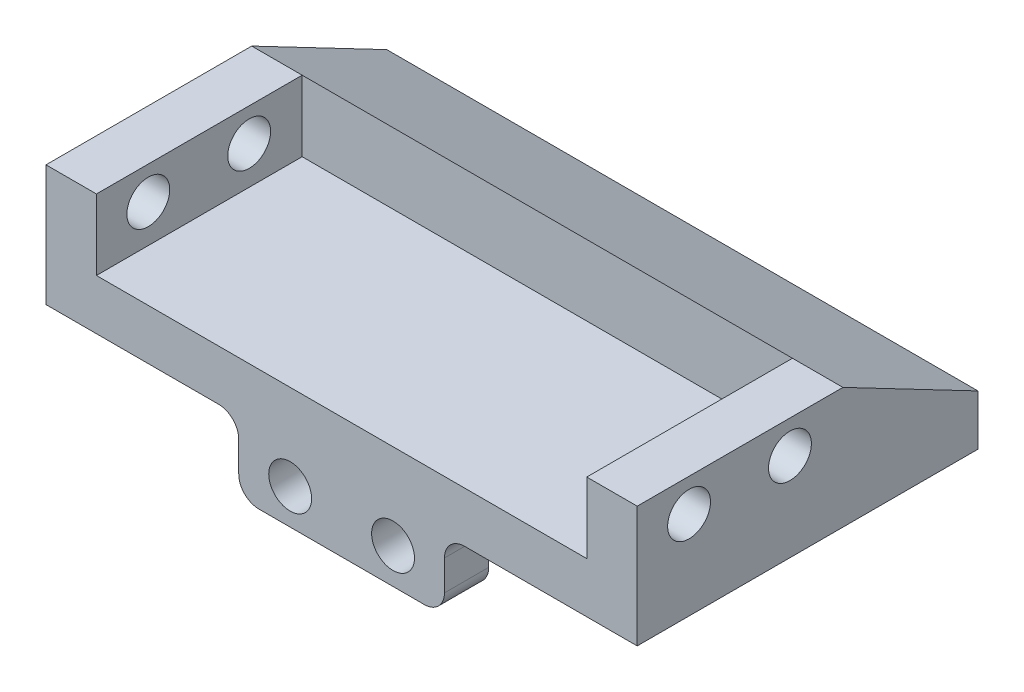
ISO-10303-21;
HEADER;
FILE_DESCRIPTION(('STEP AP214'),'2;1');
FILE_NAME('part.step','',(''),(''),'','','');
FILE_SCHEMA(('AUTOMOTIVE_DESIGN { 1 0 10303 214 1 1 1 1 }'));
ENDSEC;
DATA;
#1=APPLICATION_CONTEXT('core data for automotive mechanical design processes');
#2=APPLICATION_PROTOCOL_DEFINITION('international standard','automotive_design',2000,#1);
#3=PRODUCT_CONTEXT('',#1,'mechanical');
#4=PRODUCT('Part','Part','',(#3));
#5=PRODUCT_RELATED_PRODUCT_CATEGORY('part','',(#4));
#6=PRODUCT_DEFINITION_FORMATION('','',#4);
#7=PRODUCT_DEFINITION_CONTEXT('part definition',#1,'design');
#8=PRODUCT_DEFINITION('design','',#6,#7);
#9=PRODUCT_DEFINITION_SHAPE('','',#8);
#10=(LENGTH_UNIT() NAMED_UNIT(*) SI_UNIT(.MILLI.,.METRE.));
#11=(NAMED_UNIT(*) PLANE_ANGLE_UNIT() SI_UNIT($,.RADIAN.));
#12=(NAMED_UNIT(*) SI_UNIT($,.STERADIAN.) SOLID_ANGLE_UNIT());
#13=UNCERTAINTY_MEASURE_WITH_UNIT(LENGTH_MEASURE(1.E-05),#10,'distance_accuracy_value','');
#14=(GEOMETRIC_REPRESENTATION_CONTEXT(3) GLOBAL_UNCERTAINTY_ASSIGNED_CONTEXT((#13)) GLOBAL_UNIT_ASSIGNED_CONTEXT((#10,
#11,#12)) REPRESENTATION_CONTEXT('',''));
#15=CARTESIAN_POINT('',(0.,0.,0.));
#16=DIRECTION('',(0.,0.,1.));
#17=DIRECTION('',(1.,0.,0.));
#18=AXIS2_PLACEMENT_3D('',#15,#16,#17);
#19=CARTESIAN_POINT('',(0.,5.,0.));
#20=DIRECTION('',(1.,0.,0.));
#21=DIRECTION('',(0.,0.,-1.));
#22=AXIS2_PLACEMENT_3D('',#19,#20,#21);
#23=PLANE('',#22);
#24=CARTESIAN_POINT('',(0.,8.75,-15.13979341));
#25=DIRECTION('',(1.,0.,0.));
#26=DIRECTION('',(0.,0.,-1.));
#27=AXIS2_PLACEMENT_3D('',#24,#25,#26);
#28=CIRCLE('',#27,2.125);
#29=CARTESIAN_POINT('',(0.,8.75,-17.26479341));
#30=VERTEX_POINT('',#29);
#31=EDGE_CURVE('E240',#30,#30,#28,.T.);
#32=ORIENTED_EDGE('',*,*,#31,.T.);
#33=EDGE_LOOP('',(#32));
#34=FACE_BOUND('',#33,.T.);
#35=CARTESIAN_POINT('',(0.,8.75,-5.13979341));
#36=DIRECTION('',(1.,0.,0.));
#37=DIRECTION('',(0.,0.,-1.));
#38=AXIS2_PLACEMENT_3D('',#35,#36,#37);
#39=CIRCLE('',#38,2.125);
#40=CARTESIAN_POINT('',(0.,8.75,-7.26479341));
#41=VERTEX_POINT('',#40);
#42=EDGE_CURVE('E233',#41,#41,#39,.T.);
#43=ORIENTED_EDGE('',*,*,#42,.T.);
#44=EDGE_LOOP('',(#43));
#45=FACE_BOUND('',#44,.T.);
#46=DIRECTION('',(0.,0.,-1.));
#47=VECTOR('',#46,1.);
#48=CARTESIAN_POINT('',(0.,12.,-20.38979341));
#49=LINE('',#48,#47);
#50=CARTESIAN_POINT('',(0.,12.,0.));
#51=VERTEX_POINT('',#50);
#52=CARTESIAN_POINT('',(0.,12.,-20.38979341));
#53=VERTEX_POINT('',#52);
#54=EDGE_CURVE('E243',#51,#53,#49,.T.);
#55=ORIENTED_EDGE('',*,*,#54,.T.);
#56=DIRECTION('',(0.,-0.463295264219725,-0.88620398224764));
#57=VECTOR('',#56,1.);
#58=CARTESIAN_POINT('',(0.,12.,-20.38979341));
#59=LINE('',#58,#57);
#60=CARTESIAN_POINT('',(0.,5.,-33.77958682));
#61=VERTEX_POINT('',#60);
#62=EDGE_CURVE('E519',#53,#61,#59,.T.);
#63=ORIENTED_EDGE('',*,*,#62,.T.);
#64=DIRECTION('',(0.,1.,0.));
#65=VECTOR('',#64,1.);
#66=CARTESIAN_POINT('',(0.,0.,-33.77958682));
#67=LINE('',#66,#65);
#68=CARTESIAN_POINT('',(0.,0.,-33.77958682));
#69=VERTEX_POINT('',#68);
#70=EDGE_CURVE('E465',#69,#61,#67,.T.);
#71=ORIENTED_EDGE('',*,*,#70,.F.);
#72=DIRECTION('',(0.,0.,1.));
#73=VECTOR('',#72,1.);
#74=CARTESIAN_POINT('',(0.,0.,0.));
#75=LINE('',#74,#73);
#76=CARTESIAN_POINT('',(0.,0.,0.));
#77=VERTEX_POINT('',#76);
#78=EDGE_CURVE('E261',#69,#77,#75,.T.);
#79=ORIENTED_EDGE('',*,*,#78,.T.);
#80=DIRECTION('',(0.,-1.,0.));
#81=VECTOR('',#80,1.);
#82=CARTESIAN_POINT('',(0.,5.,0.));
#83=LINE('',#82,#81);
#84=EDGE_CURVE('E275',#51,#77,#83,.T.);
#85=ORIENTED_EDGE('',*,*,#84,.F.);
#86=EDGE_LOOP('',(#55,#63,#71,#79,#85));
#87=FACE_BOUND('',#86,.T.);
#88=ADVANCED_FACE('F38',(#34,#45,#87),#23,.F.);
#89=CARTESIAN_POINT('',(0.,5.,0.));
#90=DIRECTION('',(0.,0.,-1.));
#91=DIRECTION('',(-1.,0.,0.));
#92=AXIS2_PLACEMENT_3D('',#89,#90,#91);
#93=PLANE('',#92);
#94=CARTESIAN_POINT('',(34.3974483525,-3.49999999999999,0.));
#95=DIRECTION('',(0.,0.,1.));
#96=DIRECTION('',(1.,0.,0.));
#97=AXIS2_PLACEMENT_3D('',#94,#95,#96);
#98=CIRCLE('',#97,2.125);
#99=CARTESIAN_POINT('',(36.5224483525,-3.49999999999999,0.));
#100=VERTEX_POINT('',#99);
#101=EDGE_CURVE('E283',#100,#100,#98,.T.);
#102=ORIENTED_EDGE('',*,*,#101,.F.);
#103=EDGE_LOOP('',(#102));
#104=FACE_BOUND('',#103,.T.);
#105=CARTESIAN_POINT('',(24.2025516475,-3.49999999999999,0.));
#106=DIRECTION('',(0.,0.,1.));
#107=DIRECTION('',(-1.,0.,0.));
#108=AXIS2_PLACEMENT_3D('',#105,#106,#107);
#109=CIRCLE('',#108,2.125);
#110=CARTESIAN_POINT('',(22.0775516475,-3.49999999999999,0.));
#111=VERTEX_POINT('',#110);
#112=EDGE_CURVE('E467',#111,#111,#109,.T.);
#113=ORIENTED_EDGE('',*,*,#112,.F.);
#114=EDGE_LOOP('',(#113));
#115=FACE_BOUND('',#114,.T.);
#116=DIRECTION('',(0.,-1.,0.));
#117=VECTOR('',#116,1.);
#118=CARTESIAN_POINT('',(19.105103295,0.,0.));
#119=LINE('',#118,#117);
#120=CARTESIAN_POINT('',(19.105103295,-2.,0.));
#121=VERTEX_POINT('',#120);
#122=CARTESIAN_POINT('',(19.105103295,-5.,0.));
#123=VERTEX_POINT('',#122);
#124=EDGE_CURVE('E322',#121,#123,#119,.T.);
#125=ORIENTED_EDGE('',*,*,#124,.T.);
#126=CARTESIAN_POINT('',(21.105103295,-5.,0.));
#127=DIRECTION('',(0.,0.,-1.));
#128=DIRECTION('',(-1.,0.,0.));
#129=AXIS2_PLACEMENT_3D('',#126,#127,#128);
#130=CIRCLE('',#129,2.);
#131=CARTESIAN_POINT('',(21.105103295,-7.,0.));
#132=VERTEX_POINT('',#131);
#133=EDGE_CURVE('E293',#123,#132,#130,.F.);
#134=ORIENTED_EDGE('',*,*,#133,.T.);
#135=DIRECTION('',(1.,0.,0.));
#136=VECTOR('',#135,1.);
#137=CARTESIAN_POINT('',(39.494896705,-6.99999999999999,0.));
#138=LINE('',#137,#136);
#139=CARTESIAN_POINT('',(37.494896705,-6.99999999999999,0.));
#140=VERTEX_POINT('',#139);
#141=EDGE_CURVE('E331',#132,#140,#138,.T.);
#142=ORIENTED_EDGE('',*,*,#141,.T.);
#143=CARTESIAN_POINT('',(37.494896705,-4.99999999999999,0.));
#144=DIRECTION('',(0.,0.,-1.));
#145=DIRECTION('',(-1.,0.,0.));
#146=AXIS2_PLACEMENT_3D('',#143,#144,#145);
#147=CIRCLE('',#146,2.);
#148=CARTESIAN_POINT('',(39.494896705,-4.99999999999999,0.));
#149=VERTEX_POINT('',#148);
#150=EDGE_CURVE('E291',#140,#149,#147,.F.);
#151=ORIENTED_EDGE('',*,*,#150,.T.);
#152=DIRECTION('',(0.,1.,0.));
#153=VECTOR('',#152,1.);
#154=CARTESIAN_POINT('',(39.494896705,0.,0.));
#155=LINE('',#154,#153);
#156=CARTESIAN_POINT('',(39.494896705,-2.,0.));
#157=VERTEX_POINT('',#156);
#158=EDGE_CURVE('E286',#149,#157,#155,.T.);
#159=ORIENTED_EDGE('',*,*,#158,.T.);
#160=CARTESIAN_POINT('',(41.494896705,-2.,0.));
#161=DIRECTION('',(0.,0.,-1.));
#162=DIRECTION('',(-1.,0.,0.));
#163=AXIS2_PLACEMENT_3D('',#160,#161,#162);
#164=CIRCLE('',#163,2.);
#165=CARTESIAN_POINT('',(41.494896705,0.,0.));
#166=VERTEX_POINT('',#165);
#167=EDGE_CURVE('E315',#157,#166,#164,.T.);
#168=ORIENTED_EDGE('',*,*,#167,.T.);
#169=DIRECTION('',(1.,0.,0.));
#170=VECTOR('',#169,1.);
#171=CARTESIAN_POINT('',(0.,0.,0.));
#172=LINE('',#171,#170);
#173=CARTESIAN_POINT('',(58.6,0.,0.));
#174=VERTEX_POINT('',#173);
#175=EDGE_CURVE('E267',#166,#174,#172,.T.);
#176=ORIENTED_EDGE('',*,*,#175,.T.);
#177=DIRECTION('',(0.,-1.,0.));
#178=VECTOR('',#177,1.);
#179=CARTESIAN_POINT('',(58.6,5.,0.));
#180=LINE('',#179,#178);
#181=CARTESIAN_POINT('',(58.6,12.,0.));
#182=VERTEX_POINT('',#181);
#183=EDGE_CURVE('E263',#182,#174,#180,.T.);
#184=ORIENTED_EDGE('',*,*,#183,.F.);
#185=DIRECTION('',(1.,0.,0.));
#186=VECTOR('',#185,1.);
#187=CARTESIAN_POINT('',(53.6,12.,0.));
#188=LINE('',#187,#186);
#189=CARTESIAN_POINT('',(53.6,12.,0.));
#190=VERTEX_POINT('',#189);
#191=EDGE_CURVE('E230',#190,#182,#188,.T.);
#192=ORIENTED_EDGE('',*,*,#191,.F.);
#193=DIRECTION('',(0.,1.,0.));
#194=VECTOR('',#193,1.);
#195=CARTESIAN_POINT('',(53.6,0.,0.));
#196=LINE('',#195,#194);
#197=CARTESIAN_POINT('',(53.6,5.,0.));
#198=VERTEX_POINT('',#197);
#199=EDGE_CURVE('E236',#198,#190,#196,.T.);
#200=ORIENTED_EDGE('',*,*,#199,.F.);
#201=DIRECTION('',(1.,0.,0.));
#202=VECTOR('',#201,1.);
#203=CARTESIAN_POINT('',(0.,5.,0.));
#204=LINE('',#203,#202);
#205=CARTESIAN_POINT('',(5.,5.,0.));
#206=VERTEX_POINT('',#205);
#207=EDGE_CURVE('E228',#206,#198,#204,.T.);
#208=ORIENTED_EDGE('',*,*,#207,.F.);
#209=DIRECTION('',(0.,1.,0.));
#210=VECTOR('',#209,1.);
#211=CARTESIAN_POINT('',(5.,0.,0.));
#212=LINE('',#211,#210);
#213=CARTESIAN_POINT('',(5.,12.,0.));
#214=VERTEX_POINT('',#213);
#215=EDGE_CURVE('E249',#206,#214,#212,.T.);
#216=ORIENTED_EDGE('',*,*,#215,.T.);
#217=DIRECTION('',(-1.,0.,0.));
#218=VECTOR('',#217,1.);
#219=CARTESIAN_POINT('',(5.,12.,0.));
#220=LINE('',#219,#218);
#221=EDGE_CURVE('E254',#214,#51,#220,.T.);
#222=ORIENTED_EDGE('',*,*,#221,.T.);
#223=ORIENTED_EDGE('',*,*,#84,.T.);
#224=CARTESIAN_POINT('',(17.105103295,0.,0.));
#225=VERTEX_POINT('',#224);
#226=EDGE_CURVE('E268',#77,#225,#172,.T.);
#227=ORIENTED_EDGE('',*,*,#226,.T.);
#228=CARTESIAN_POINT('',(17.105103295,-2.,0.));
#229=DIRECTION('',(0.,0.,-1.));
#230=DIRECTION('',(-1.,0.,0.));
#231=AXIS2_PLACEMENT_3D('',#228,#229,#230);
#232=CIRCLE('',#231,2.);
#233=EDGE_CURVE('E46',#225,#121,#232,.T.);
#234=ORIENTED_EDGE('',*,*,#233,.T.);
#235=EDGE_LOOP('',(#125,#134,#142,#151,#159,#168,#176,#184,#192,#200,#208,#216,#222,#223,#227,#234));
#236=FACE_BOUND('',#235,.T.);
#237=ADVANCED_FACE('F321',(#104,#115,#236),#93,.F.);
#238=CARTESIAN_POINT('',(58.6,5.,0.));
#239=DIRECTION('',(-1.,0.,0.));
#240=DIRECTION('',(0.,0.,1.));
#241=AXIS2_PLACEMENT_3D('',#238,#239,#240);
#242=PLANE('',#241);
#243=DIRECTION('',(0.,0.463295264219725,0.88620398224764));
#244=VECTOR('',#243,1.);
#245=CARTESIAN_POINT('',(58.6,18.869023730878,-7.25053502645087));
#246=LINE('',#245,#244);
#247=CARTESIAN_POINT('',(58.6,5.,-33.77958682));
#248=VERTEX_POINT('',#247);
#249=CARTESIAN_POINT('',(58.6,12.,-20.38979341));
#250=VERTEX_POINT('',#249);
#251=EDGE_CURVE('E379',#248,#250,#246,.T.);
#252=ORIENTED_EDGE('',*,*,#251,.T.);
#253=DIRECTION('',(0.,0.,-1.));
#254=VECTOR('',#253,1.);
#255=CARTESIAN_POINT('',(58.6,12.,-20.38979341));
#256=LINE('',#255,#254);
#257=EDGE_CURVE('E356',#182,#250,#256,.T.);
#258=ORIENTED_EDGE('',*,*,#257,.F.);
#259=ORIENTED_EDGE('',*,*,#183,.T.);
#260=DIRECTION('',(0.,0.,-1.));
#261=VECTOR('',#260,1.);
#262=CARTESIAN_POINT('',(58.6,0.,0.));
#263=LINE('',#262,#261);
#264=CARTESIAN_POINT('',(58.6,0.,-33.77958682));
#265=VERTEX_POINT('',#264);
#266=EDGE_CURVE('E264',#174,#265,#263,.T.);
#267=ORIENTED_EDGE('',*,*,#266,.T.);
#268=DIRECTION('',(0.,-1.,0.));
#269=VECTOR('',#268,1.);
#270=CARTESIAN_POINT('',(58.6,12.,-33.77958682));
#271=LINE('',#270,#269);
#272=EDGE_CURVE('E380',#248,#265,#271,.T.);
#273=ORIENTED_EDGE('',*,*,#272,.F.);
#274=EDGE_LOOP('',(#252,#258,#259,#267,#273));
#275=FACE_BOUND('',#274,.T.);
#276=CARTESIAN_POINT('',(58.6,8.75,-15.13979341));
#277=DIRECTION('',(1.,0.,0.));
#278=DIRECTION('',(0.,0.,-1.));
#279=AXIS2_PLACEMENT_3D('',#276,#277,#278);
#280=CIRCLE('',#279,2.125);
#281=CARTESIAN_POINT('',(58.6,8.75,-17.26479341));
#282=VERTEX_POINT('',#281);
#283=EDGE_CURVE('E353',#282,#282,#280,.T.);
#284=ORIENTED_EDGE('',*,*,#283,.F.);
#285=EDGE_LOOP('',(#284));
#286=FACE_BOUND('',#285,.T.);
#287=CARTESIAN_POINT('',(58.6,8.75,-5.13979341));
#288=DIRECTION('',(1.,0.,0.));
#289=DIRECTION('',(0.,0.,-1.));
#290=AXIS2_PLACEMENT_3D('',#287,#288,#289);
#291=CIRCLE('',#290,2.125);
#292=CARTESIAN_POINT('',(58.6,8.75,-7.26479341));
#293=VERTEX_POINT('',#292);
#294=EDGE_CURVE('E360',#293,#293,#291,.T.);
#295=ORIENTED_EDGE('',*,*,#294,.F.);
#296=EDGE_LOOP('',(#295));
#297=FACE_BOUND('',#296,.T.);
#298=ADVANCED_FACE('F375',(#275,#286,#297),#242,.F.);
#299=CARTESIAN_POINT('',(0.,5.,0.));
#300=DIRECTION('',(0.,-1.,0.));
#301=DIRECTION('',(0.,0.,-1.));
#302=AXIS2_PLACEMENT_3D('',#299,#300,#301);
#303=PLANE('',#302);
#304=DIRECTION('',(0.,0.,-1.));
#305=VECTOR('',#304,1.);
#306=CARTESIAN_POINT('',(53.6,5.,0.));
#307=LINE('',#306,#305);
#308=CARTESIAN_POINT('',(53.6,5.,-20.38979341));
#309=VERTEX_POINT('',#308);
#310=EDGE_CURVE('E221',#198,#309,#307,.T.);
#311=ORIENTED_EDGE('',*,*,#310,.T.);
#312=DIRECTION('',(-1.,0.,0.));
#313=VECTOR('',#312,1.);
#314=CARTESIAN_POINT('',(73.7091550909533,5.,-20.38979341));
#315=LINE('',#314,#313);
#316=CARTESIAN_POINT('',(5.,5.,-20.38979341));
#317=VERTEX_POINT('',#316);
#318=EDGE_CURVE('E204',#309,#317,#315,.T.);
#319=ORIENTED_EDGE('',*,*,#318,.T.);
#320=DIRECTION('',(0.,0.,1.));
#321=VECTOR('',#320,1.);
#322=CARTESIAN_POINT('',(5.,5.,0.));
#323=LINE('',#322,#321);
#324=EDGE_CURVE('E259',#317,#206,#323,.T.);
#325=ORIENTED_EDGE('',*,*,#324,.T.);
#326=ORIENTED_EDGE('',*,*,#207,.T.);
#327=EDGE_LOOP('',(#311,#319,#325,#326));
#328=FACE_BOUND('',#327,.T.);
#329=ADVANCED_FACE('F226',(#328),#303,.F.);
#330=CARTESIAN_POINT('',(0.,0.,0.));
#331=DIRECTION('',(0.,-1.,0.));
#332=DIRECTION('',(0.,0.,-1.));
#333=AXIS2_PLACEMENT_3D('',#330,#331,#332);
#334=PLANE('',#333);
#335=DIRECTION('',(0.,0.,-1.));
#336=VECTOR('',#335,1.);
#337=CARTESIAN_POINT('',(41.494896705,0.,-29.38979341));
#338=LINE('',#337,#336);
#339=CARTESIAN_POINT('',(41.494896705,0.,-29.38979341));
#340=VERTEX_POINT('',#339);
#341=CARTESIAN_POINT('',(41.494896705,0.,-33.77958682));
#342=VERTEX_POINT('',#341);
#343=EDGE_CURVE('E447',#340,#342,#338,.T.);
#344=ORIENTED_EDGE('',*,*,#343,.T.);
#345=DIRECTION('',(-1.,0.,0.));
#346=VECTOR('',#345,1.);
#347=CARTESIAN_POINT('',(58.6,0.,-33.77958682));
#348=LINE('',#347,#346);
#349=EDGE_CURVE('E462',#265,#342,#348,.T.);
#350=ORIENTED_EDGE('',*,*,#349,.F.);
#351=ORIENTED_EDGE('',*,*,#266,.F.);
#352=ORIENTED_EDGE('',*,*,#175,.F.);
#353=DIRECTION('',(0.,0.,1.));
#354=VECTOR('',#353,1.);
#355=CARTESIAN_POINT('',(41.494896705,0.,-4.38979341));
#356=LINE('',#355,#354);
#357=CARTESIAN_POINT('',(41.494896705,0.,-4.38979341));
#358=VERTEX_POINT('',#357);
#359=EDGE_CURVE('E312',#166,#358,#356,.F.);
#360=ORIENTED_EDGE('',*,*,#359,.T.);
#361=DIRECTION('',(-1.,0.,0.));
#362=VECTOR('',#361,1.);
#363=CARTESIAN_POINT('',(39.494896705,0.,-4.38979341));
#364=LINE('',#363,#362);
#365=CARTESIAN_POINT('',(17.105103295,0.,-4.38979341));
#366=VERTEX_POINT('',#365);
#367=EDGE_CURVE('E337',#358,#366,#364,.T.);
#368=ORIENTED_EDGE('',*,*,#367,.T.);
#369=DIRECTION('',(0.,0.,1.));
#370=VECTOR('',#369,1.);
#371=CARTESIAN_POINT('',(17.105103295,0.,0.));
#372=LINE('',#371,#370);
#373=EDGE_CURVE('E309',#366,#225,#372,.T.);
#374=ORIENTED_EDGE('',*,*,#373,.T.);
#375=ORIENTED_EDGE('',*,*,#226,.F.);
#376=ORIENTED_EDGE('',*,*,#78,.F.);
#377=CARTESIAN_POINT('',(17.105103295,0.,-33.77958682));
#378=VERTEX_POINT('',#377);
#379=EDGE_CURVE('E461',#378,#69,#348,.T.);
#380=ORIENTED_EDGE('',*,*,#379,.F.);
#381=DIRECTION('',(0.,0.,-1.));
#382=VECTOR('',#381,1.);
#383=CARTESIAN_POINT('',(17.105103295,0.,-29.38979341));
#384=LINE('',#383,#382);
#385=CARTESIAN_POINT('',(17.105103295,0.,-29.38979341));
#386=VERTEX_POINT('',#385);
#387=EDGE_CURVE('E450',#386,#378,#384,.T.);
#388=ORIENTED_EDGE('',*,*,#387,.F.);
#389=DIRECTION('',(1.,0.,0.));
#390=VECTOR('',#389,1.);
#391=CARTESIAN_POINT('',(17.105103295,0.,-29.38979341));
#392=LINE('',#391,#390);
#393=EDGE_CURVE('E417',#386,#340,#392,.T.);
#394=ORIENTED_EDGE('',*,*,#393,.T.);
#395=EDGE_LOOP('',(#344,#350,#351,#352,#360,#368,#374,#375,#376,#380,#388,#394));
#396=FACE_BOUND('',#395,.T.);
#397=ADVANCED_FACE('F485',(#396),#334,.T.);
#398=CARTESIAN_POINT('',(5.,0.,0.));
#399=DIRECTION('',(1.,0.,0.));
#400=DIRECTION('',(0.,0.,-1.));
#401=AXIS2_PLACEMENT_3D('',#398,#399,#400);
#402=PLANE('',#401);
#403=DIRECTION('',(0.,-1.,0.));
#404=VECTOR('',#403,1.);
#405=CARTESIAN_POINT('',(5.,0.,-20.38979341));
#406=LINE('',#405,#404);
#407=CARTESIAN_POINT('',(5.,12.,-20.38979341));
#408=VERTEX_POINT('',#407);
#409=EDGE_CURVE('E210',#408,#317,#406,.T.);
#410=ORIENTED_EDGE('',*,*,#409,.F.);
#411=DIRECTION('',(0.,0.,-1.));
#412=VECTOR('',#411,1.);
#413=CARTESIAN_POINT('',(5.,12.,-20.38979341));
#414=LINE('',#413,#412);
#415=EDGE_CURVE('E251',#214,#408,#414,.T.);
#416=ORIENTED_EDGE('',*,*,#415,.F.);
#417=ORIENTED_EDGE('',*,*,#215,.F.);
#418=ORIENTED_EDGE('',*,*,#324,.F.);
#419=EDGE_LOOP('',(#410,#416,#417,#418));
#420=FACE_BOUND('',#419,.T.);
#421=CARTESIAN_POINT('',(5.,8.75,-15.13979341));
#422=DIRECTION('',(1.,0.,0.));
#423=DIRECTION('',(0.,0.,-1.));
#424=AXIS2_PLACEMENT_3D('',#421,#422,#423);
#425=CIRCLE('',#424,2.125);
#426=CARTESIAN_POINT('',(5.,8.75,-17.26479341));
#427=VERTEX_POINT('',#426);
#428=EDGE_CURVE('E244',#427,#427,#425,.T.);
#429=ORIENTED_EDGE('',*,*,#428,.F.);
#430=EDGE_LOOP('',(#429));
#431=FACE_BOUND('',#430,.T.);
#432=CARTESIAN_POINT('',(5.,8.75,-5.13979341));
#433=DIRECTION('',(1.,0.,0.));
#434=DIRECTION('',(0.,0.,-1.));
#435=AXIS2_PLACEMENT_3D('',#432,#433,#434);
#436=CIRCLE('',#435,2.125);
#437=CARTESIAN_POINT('',(5.,8.75,-7.26479341));
#438=VERTEX_POINT('',#437);
#439=EDGE_CURVE('E229',#438,#438,#436,.T.);
#440=ORIENTED_EDGE('',*,*,#439,.F.);
#441=EDGE_LOOP('',(#440));
#442=FACE_BOUND('',#441,.T.);
#443=ADVANCED_FACE('F526',(#420,#431,#442),#402,.T.);
#444=CARTESIAN_POINT('',(5.,12.,-20.38979341));
#445=DIRECTION('',(0.,1.,0.));
#446=DIRECTION('',(0.,0.,1.));
#447=AXIS2_PLACEMENT_3D('',#444,#445,#446);
#448=PLANE('',#447);
#449=DIRECTION('',(1.,0.,0.));
#450=VECTOR('',#449,1.);
#451=CARTESIAN_POINT('',(0.,12.,-20.38979341));
#452=LINE('',#451,#450);
#453=EDGE_CURVE('E383',#53,#408,#452,.T.);
#454=ORIENTED_EDGE('',*,*,#453,.F.);
#455=ORIENTED_EDGE('',*,*,#54,.F.);
#456=ORIENTED_EDGE('',*,*,#221,.F.);
#457=ORIENTED_EDGE('',*,*,#415,.T.);
#458=EDGE_LOOP('',(#454,#455,#456,#457));
#459=FACE_BOUND('',#458,.T.);
#460=ADVANCED_FACE('F532',(#459),#448,.T.);
#461=CARTESIAN_POINT('',(0.,8.75,-5.13979341));
#462=DIRECTION('',(1.,0.,0.));
#463=DIRECTION('',(0.,0.,-1.));
#464=AXIS2_PLACEMENT_3D('',#461,#462,#463);
#465=CYLINDRICAL_SURFACE('',#464,2.125);
#466=ORIENTED_EDGE('',*,*,#42,.F.);
#467=EDGE_LOOP('',(#466));
#468=FACE_BOUND('',#467,.T.);
#469=ORIENTED_EDGE('',*,*,#439,.T.);
#470=EDGE_LOOP('',(#469));
#471=FACE_BOUND('',#470,.T.);
#472=ADVANCED_FACE('F534',(#468,#471),#465,.F.);
#473=CARTESIAN_POINT('',(0.,8.75,-15.13979341));
#474=DIRECTION('',(1.,0.,0.));
#475=DIRECTION('',(0.,0.,-1.));
#476=AXIS2_PLACEMENT_3D('',#473,#474,#475);
#477=CYLINDRICAL_SURFACE('',#476,2.125);
#478=ORIENTED_EDGE('',*,*,#31,.F.);
#479=EDGE_LOOP('',(#478));
#480=FACE_BOUND('',#479,.T.);
#481=ORIENTED_EDGE('',*,*,#428,.T.);
#482=EDGE_LOOP('',(#481));
#483=FACE_BOUND('',#482,.T.);
#484=ADVANCED_FACE('F540',(#480,#483),#477,.F.);
#485=CARTESIAN_POINT('',(53.6,0.,0.));
#486=DIRECTION('',(-1.,0.,0.));
#487=DIRECTION('',(0.,0.,-1.));
#488=AXIS2_PLACEMENT_3D('',#485,#486,#487);
#489=PLANE('',#488);
#490=DIRECTION('',(0.,1.,0.));
#491=VECTOR('',#490,1.);
#492=CARTESIAN_POINT('',(53.6,0.,-20.38979341));
#493=LINE('',#492,#491);
#494=CARTESIAN_POINT('',(53.6,12.,-20.38979341));
#495=VERTEX_POINT('',#494);
#496=EDGE_CURVE('E207',#309,#495,#493,.T.);
#497=ORIENTED_EDGE('',*,*,#496,.F.);
#498=ORIENTED_EDGE('',*,*,#310,.F.);
#499=ORIENTED_EDGE('',*,*,#199,.T.);
#500=DIRECTION('',(0.,0.,-1.));
#501=VECTOR('',#500,1.);
#502=CARTESIAN_POINT('',(53.6,12.,-20.38979341));
#503=LINE('',#502,#501);
#504=EDGE_CURVE('E224',#190,#495,#503,.T.);
#505=ORIENTED_EDGE('',*,*,#504,.T.);
#506=EDGE_LOOP('',(#497,#498,#499,#505));
#507=FACE_BOUND('',#506,.T.);
#508=CARTESIAN_POINT('',(53.6,8.75,-15.13979341));
#509=DIRECTION('',(1.,0.,0.));
#510=DIRECTION('',(0.,0.,-1.));
#511=AXIS2_PLACEMENT_3D('',#508,#509,#510);
#512=CIRCLE('',#511,2.125);
#513=CARTESIAN_POINT('',(53.6,8.75,-17.26479341));
#514=VERTEX_POINT('',#513);
#515=EDGE_CURVE('E357',#514,#514,#512,.T.);
#516=ORIENTED_EDGE('',*,*,#515,.T.);
#517=EDGE_LOOP('',(#516));
#518=FACE_BOUND('',#517,.T.);
#519=CARTESIAN_POINT('',(53.6,8.75,-5.13979341));
#520=DIRECTION('',(1.,0.,0.));
#521=DIRECTION('',(0.,0.,-1.));
#522=AXIS2_PLACEMENT_3D('',#519,#520,#521);
#523=CIRCLE('',#522,2.125);
#524=CARTESIAN_POINT('',(53.6,8.75,-7.26479341));
#525=VERTEX_POINT('',#524);
#526=EDGE_CURVE('E343',#525,#525,#523,.T.);
#527=ORIENTED_EDGE('',*,*,#526,.T.);
#528=EDGE_LOOP('',(#527));
#529=FACE_BOUND('',#528,.T.);
#530=ADVANCED_FACE('F219',(#507,#518,#529),#489,.T.);
#531=CARTESIAN_POINT('',(53.6,12.,-20.38979341));
#532=DIRECTION('',(0.,-1.,0.));
#533=DIRECTION('',(0.,0.,-1.));
#534=AXIS2_PLACEMENT_3D('',#531,#532,#533);
#535=PLANE('',#534);
#536=ORIENTED_EDGE('',*,*,#257,.T.);
#537=EDGE_CURVE('E371',#495,#250,#452,.T.);
#538=ORIENTED_EDGE('',*,*,#537,.F.);
#539=ORIENTED_EDGE('',*,*,#504,.F.);
#540=ORIENTED_EDGE('',*,*,#191,.T.);
#541=EDGE_LOOP('',(#536,#538,#539,#540));
#542=FACE_BOUND('',#541,.T.);
#543=ADVANCED_FACE('F370',(#542),#535,.F.);
#544=CARTESIAN_POINT('',(58.6,8.75,-5.13979341));
#545=DIRECTION('',(-1.,0.,0.));
#546=DIRECTION('',(0.,0.,1.));
#547=AXIS2_PLACEMENT_3D('',#544,#545,#546);
#548=CYLINDRICAL_SURFACE('',#547,2.125);
#549=ORIENTED_EDGE('',*,*,#294,.T.);
#550=EDGE_LOOP('',(#549));
#551=FACE_BOUND('',#550,.T.);
#552=ORIENTED_EDGE('',*,*,#526,.F.);
#553=EDGE_LOOP('',(#552));
#554=FACE_BOUND('',#553,.T.);
#555=ADVANCED_FACE('F599',(#551,#554),#548,.F.);
#556=CARTESIAN_POINT('',(58.6,8.75,-15.13979341));
#557=DIRECTION('',(-1.,0.,0.));
#558=DIRECTION('',(0.,0.,1.));
#559=AXIS2_PLACEMENT_3D('',#556,#557,#558);
#560=CYLINDRICAL_SURFACE('',#559,2.125);
#561=ORIENTED_EDGE('',*,*,#283,.T.);
#562=EDGE_LOOP('',(#561));
#563=FACE_BOUND('',#562,.T.);
#564=ORIENTED_EDGE('',*,*,#515,.F.);
#565=EDGE_LOOP('',(#564));
#566=FACE_BOUND('',#565,.T.);
#567=ADVANCED_FACE('F596',(#563,#566),#560,.F.);
#568=CARTESIAN_POINT('',(39.494896705,0.,-4.38979341));
#569=DIRECTION('',(1.,0.,0.));
#570=DIRECTION('',(0.,0.,-1.));
#571=AXIS2_PLACEMENT_3D('',#568,#569,#570);
#572=PLANE('',#571);
#573=ORIENTED_EDGE('',*,*,#158,.F.);
#574=DIRECTION('',(0.,0.,1.));
#575=VECTOR('',#574,1.);
#576=CARTESIAN_POINT('',(39.494896705,-4.99999999999999,-4.38979341));
#577=LINE('',#576,#575);
#578=CARTESIAN_POINT('',(39.494896705,-4.99999999999999,-4.38979341));
#579=VERTEX_POINT('',#578);
#580=EDGE_CURVE('E307',#149,#579,#577,.F.);
#581=ORIENTED_EDGE('',*,*,#580,.T.);
#582=DIRECTION('',(0.,1.,0.));
#583=VECTOR('',#582,1.);
#584=CARTESIAN_POINT('',(39.494896705,0.,-4.38979341));
#585=LINE('',#584,#583);
#586=CARTESIAN_POINT('',(39.494896705,-2.,-4.38979341));
#587=VERTEX_POINT('',#586);
#588=EDGE_CURVE('E345',#579,#587,#585,.T.);
#589=ORIENTED_EDGE('',*,*,#588,.T.);
#590=DIRECTION('',(0.,0.,1.));
#591=VECTOR('',#590,1.);
#592=CARTESIAN_POINT('',(39.494896705,-2.,0.));
#593=LINE('',#592,#591);
#594=EDGE_CURVE('E304',#587,#157,#593,.T.);
#595=ORIENTED_EDGE('',*,*,#594,.T.);
#596=EDGE_LOOP('',(#573,#581,#589,#595));
#597=FACE_BOUND('',#596,.T.);
#598=ADVANCED_FACE('F476',(#597),#572,.T.);
#599=CARTESIAN_POINT('',(39.494896705,-6.99999999999999,-4.38979341));
#600=DIRECTION('',(0.,-1.,0.));
#601=DIRECTION('',(1.,0.,0.));
#602=AXIS2_PLACEMENT_3D('',#599,#600,#601);
#603=PLANE('',#602);
#604=ORIENTED_EDGE('',*,*,#141,.F.);
#605=DIRECTION('',(0.,0.,1.));
#606=VECTOR('',#605,1.);
#607=CARTESIAN_POINT('',(21.105103295,-7.,-4.38979341));
#608=LINE('',#607,#606);
#609=CARTESIAN_POINT('',(21.105103295,-7.,-4.38979341));
#610=VERTEX_POINT('',#609);
#611=EDGE_CURVE('E298',#132,#610,#608,.F.);
#612=ORIENTED_EDGE('',*,*,#611,.T.);
#613=DIRECTION('',(1.,0.,0.));
#614=VECTOR('',#613,1.);
#615=CARTESIAN_POINT('',(39.494896705,-6.99999999999999,-4.38979341));
#616=LINE('',#615,#614);
#617=CARTESIAN_POINT('',(37.494896705,-6.99999999999999,-4.38979341));
#618=VERTEX_POINT('',#617);
#619=EDGE_CURVE('E340',#610,#618,#616,.T.);
#620=ORIENTED_EDGE('',*,*,#619,.T.);
#621=DIRECTION('',(0.,0.,1.));
#622=VECTOR('',#621,1.);
#623=CARTESIAN_POINT('',(37.494896705,-6.99999999999999,-4.38979341));
#624=LINE('',#623,#622);
#625=EDGE_CURVE('E295',#618,#140,#624,.T.);
#626=ORIENTED_EDGE('',*,*,#625,.T.);
#627=EDGE_LOOP('',(#604,#612,#620,#626));
#628=FACE_BOUND('',#627,.T.);
#629=ADVANCED_FACE('F588',(#628),#603,.T.);
#630=CARTESIAN_POINT('',(19.105103295,0.,-4.38979341));
#631=DIRECTION('',(-1.,0.,0.));
#632=DIRECTION('',(0.,-1.,0.));
#633=AXIS2_PLACEMENT_3D('',#630,#631,#632);
#634=PLANE('',#633);
#635=DIRECTION('',(0.,-1.,0.));
#636=VECTOR('',#635,1.);
#637=CARTESIAN_POINT('',(19.105103295,0.,-4.38979341));
#638=LINE('',#637,#636);
#639=CARTESIAN_POINT('',(19.105103295,-2.,-4.38979341));
#640=VERTEX_POINT('',#639);
#641=CARTESIAN_POINT('',(19.105103295,-5.,-4.38979341));
#642=VERTEX_POINT('',#641);
#643=EDGE_CURVE('E338',#640,#642,#638,.T.);
#644=ORIENTED_EDGE('',*,*,#643,.T.);
#645=DIRECTION('',(0.,0.,1.));
#646=VECTOR('',#645,1.);
#647=CARTESIAN_POINT('',(19.105103295,-5.,-4.38979341));
#648=LINE('',#647,#646);
#649=EDGE_CURVE('E288',#642,#123,#648,.T.);
#650=ORIENTED_EDGE('',*,*,#649,.T.);
#651=ORIENTED_EDGE('',*,*,#124,.F.);
#652=DIRECTION('',(0.,0.,1.));
#653=VECTOR('',#652,1.);
#654=CARTESIAN_POINT('',(19.105103295,-2.,-4.38979341));
#655=LINE('',#654,#653);
#656=EDGE_CURVE('E278',#121,#640,#655,.F.);
#657=ORIENTED_EDGE('',*,*,#656,.T.);
#658=EDGE_LOOP('',(#644,#650,#651,#657));
#659=FACE_BOUND('',#658,.T.);
#660=ADVANCED_FACE('F328',(#659),#634,.T.);
#661=CARTESIAN_POINT('',(0.,0.,-4.38979341));
#662=DIRECTION('',(0.,0.,-1.));
#663=DIRECTION('',(-1.,0.,0.));
#664=AXIS2_PLACEMENT_3D('',#661,#662,#663);
#665=PLANE('',#664);
#666=CARTESIAN_POINT('',(34.3974483525,-3.49999999999999,-4.38979341));
#667=DIRECTION('',(0.,0.,-1.));
#668=DIRECTION('',(-1.,0.,0.));
#669=AXIS2_PLACEMENT_3D('',#666,#667,#668);
#670=CIRCLE('',#669,2.125);
#671=CARTESIAN_POINT('',(32.2724483525,-3.49999999999999,-4.38979341));
#672=VERTEX_POINT('',#671);
#673=EDGE_CURVE('E282',#672,#672,#670,.T.);
#674=ORIENTED_EDGE('',*,*,#673,.F.);
#675=EDGE_LOOP('',(#674));
#676=FACE_BOUND('',#675,.T.);
#677=CARTESIAN_POINT('',(24.2025516475,-3.49999999999999,-4.38979341));
#678=DIRECTION('',(0.,0.,-1.));
#679=DIRECTION('',(-1.,0.,0.));
#680=AXIS2_PLACEMENT_3D('',#677,#678,#679);
#681=CIRCLE('',#680,2.125);
#682=CARTESIAN_POINT('',(22.0775516475,-3.49999999999999,-4.38979341));
#683=VERTEX_POINT('',#682);
#684=EDGE_CURVE('E279',#683,#683,#681,.T.);
#685=ORIENTED_EDGE('',*,*,#684,.F.);
#686=EDGE_LOOP('',(#685));
#687=FACE_BOUND('',#686,.T.);
#688=ORIENTED_EDGE('',*,*,#619,.F.);
#689=CARTESIAN_POINT('',(21.105103295,-5.,-4.38979341));
#690=DIRECTION('',(0.,0.,-1.));
#691=DIRECTION('',(-1.,0.,0.));
#692=AXIS2_PLACEMENT_3D('',#689,#690,#691);
#693=CIRCLE('',#692,2.);
#694=EDGE_CURVE('E302',#610,#642,#693,.T.);
#695=ORIENTED_EDGE('',*,*,#694,.T.);
#696=ORIENTED_EDGE('',*,*,#643,.F.);
#697=CARTESIAN_POINT('',(17.105103295,-2.,-4.38979341));
#698=DIRECTION('',(0.,0.,-1.));
#699=DIRECTION('',(-1.,0.,0.));
#700=AXIS2_PLACEMENT_3D('',#697,#698,#699);
#701=CIRCLE('',#700,2.);
#702=EDGE_CURVE('E11',#640,#366,#701,.F.);
#703=ORIENTED_EDGE('',*,*,#702,.T.);
#704=ORIENTED_EDGE('',*,*,#367,.F.);
#705=CARTESIAN_POINT('',(41.494896705,-2.,-4.38979341));
#706=DIRECTION('',(0.,0.,-1.));
#707=DIRECTION('',(-1.,0.,0.));
#708=AXIS2_PLACEMENT_3D('',#705,#706,#707);
#709=CIRCLE('',#708,2.);
#710=EDGE_CURVE('E317',#358,#587,#709,.F.);
#711=ORIENTED_EDGE('',*,*,#710,.T.);
#712=ORIENTED_EDGE('',*,*,#588,.F.);
#713=CARTESIAN_POINT('',(37.494896705,-4.99999999999999,-4.38979341));
#714=DIRECTION('',(0.,0.,-1.));
#715=DIRECTION('',(-1.,0.,0.));
#716=AXIS2_PLACEMENT_3D('',#713,#714,#715);
#717=CIRCLE('',#716,2.);
#718=EDGE_CURVE('E300',#579,#618,#717,.T.);
#719=ORIENTED_EDGE('',*,*,#718,.T.);
#720=EDGE_LOOP('',(#688,#695,#696,#703,#704,#711,#712,#719));
#721=FACE_BOUND('',#720,.T.);
#722=ADVANCED_FACE('F336',(#676,#687,#721),#665,.T.);
#723=CARTESIAN_POINT('',(24.2025516475,-3.49999999999999,-5.));
#724=DIRECTION('',(0.,0.,1.));
#725=DIRECTION('',(1.,0.,0.));
#726=AXIS2_PLACEMENT_3D('',#723,#724,#725);
#727=CYLINDRICAL_SURFACE('',#726,2.125);
#728=ORIENTED_EDGE('',*,*,#684,.T.);
#729=EDGE_LOOP('',(#728));
#730=FACE_BOUND('',#729,.T.);
#731=ORIENTED_EDGE('',*,*,#112,.T.);
#732=EDGE_LOOP('',(#731));
#733=FACE_BOUND('',#732,.T.);
#734=ADVANCED_FACE('F580',(#730,#733),#727,.F.);
#735=CARTESIAN_POINT('',(34.3974483525,-3.49999999999999,-5.));
#736=DIRECTION('',(0.,0.,1.));
#737=DIRECTION('',(1.,0.,0.));
#738=AXIS2_PLACEMENT_3D('',#735,#736,#737);
#739=CYLINDRICAL_SURFACE('',#738,2.125);
#740=ORIENTED_EDGE('',*,*,#673,.T.);
#741=EDGE_LOOP('',(#740));
#742=FACE_BOUND('',#741,.T.);
#743=ORIENTED_EDGE('',*,*,#101,.T.);
#744=EDGE_LOOP('',(#743));
#745=FACE_BOUND('',#744,.T.);
#746=ADVANCED_FACE('F560',(#742,#745),#739,.F.);
#747=CARTESIAN_POINT('',(21.105103295,-5.,-4.38979341));
#748=DIRECTION('',(0.,0.,1.));
#749=DIRECTION('',(1.,0.,0.));
#750=AXIS2_PLACEMENT_3D('',#747,#748,#749);
#751=CYLINDRICAL_SURFACE('',#750,2.);
#752=ORIENTED_EDGE('',*,*,#694,.F.);
#753=ORIENTED_EDGE('',*,*,#611,.F.);
#754=ORIENTED_EDGE('',*,*,#133,.F.);
#755=ORIENTED_EDGE('',*,*,#649,.F.);
#756=EDGE_LOOP('',(#752,#753,#754,#755));
#757=FACE_BOUND('',#756,.T.);
#758=ADVANCED_FACE('F556',(#757),#751,.T.);
#759=CARTESIAN_POINT('',(37.494896705,-4.99999999999999,-4.38979341));
#760=DIRECTION('',(0.,0.,1.));
#761=DIRECTION('',(1.,0.,0.));
#762=AXIS2_PLACEMENT_3D('',#759,#760,#761);
#763=CYLINDRICAL_SURFACE('',#762,2.);
#764=ORIENTED_EDGE('',*,*,#718,.F.);
#765=ORIENTED_EDGE('',*,*,#580,.F.);
#766=ORIENTED_EDGE('',*,*,#150,.F.);
#767=ORIENTED_EDGE('',*,*,#625,.F.);
#768=EDGE_LOOP('',(#764,#765,#766,#767));
#769=FACE_BOUND('',#768,.T.);
#770=ADVANCED_FACE('F559',(#769),#763,.T.);
#771=CARTESIAN_POINT('',(41.494896705,-2.,-4.38979341));
#772=DIRECTION('',(0.,0.,-1.));
#773=DIRECTION('',(-1.,0.,0.));
#774=AXIS2_PLACEMENT_3D('',#771,#772,#773);
#775=CYLINDRICAL_SURFACE('',#774,2.);
#776=ORIENTED_EDGE('',*,*,#710,.F.);
#777=ORIENTED_EDGE('',*,*,#359,.F.);
#778=ORIENTED_EDGE('',*,*,#167,.F.);
#779=ORIENTED_EDGE('',*,*,#594,.F.);
#780=EDGE_LOOP('',(#776,#777,#778,#779));
#781=FACE_BOUND('',#780,.T.);
#782=ADVANCED_FACE('F481',(#781),#775,.F.);
#783=CARTESIAN_POINT('',(17.105103295,-2.,0.));
#784=DIRECTION('',(0.,0.,-1.));
#785=DIRECTION('',(-1.,0.,0.));
#786=AXIS2_PLACEMENT_3D('',#783,#784,#785);
#787=CYLINDRICAL_SURFACE('',#786,2.);
#788=ORIENTED_EDGE('',*,*,#702,.F.);
#789=ORIENTED_EDGE('',*,*,#656,.F.);
#790=ORIENTED_EDGE('',*,*,#233,.F.);
#791=ORIENTED_EDGE('',*,*,#373,.F.);
#792=EDGE_LOOP('',(#788,#789,#790,#791));
#793=FACE_BOUND('',#792,.T.);
#794=ADVANCED_FACE('F40',(#793),#787,.F.);
#795=CARTESIAN_POINT('',(0.,0.,-33.77958682));
#796=DIRECTION('',(0.,0.,1.));
#797=DIRECTION('',(1.,0.,0.));
#798=AXIS2_PLACEMENT_3D('',#795,#796,#797);
#799=PLANE('',#798);
#800=ORIENTED_EDGE('',*,*,#70,.T.);
#801=DIRECTION('',(1.,0.,0.));
#802=VECTOR('',#801,1.);
#803=CARTESIAN_POINT('',(5.,5.,-33.77958682));
#804=LINE('',#803,#802);
#805=EDGE_CURVE('E53',#61,#248,#804,.T.);
#806=ORIENTED_EDGE('',*,*,#805,.T.);
#807=ORIENTED_EDGE('',*,*,#272,.T.);
#808=ORIENTED_EDGE('',*,*,#349,.T.);
#809=CARTESIAN_POINT('',(41.494896705,-2.,-33.77958682));
#810=DIRECTION('',(0.,0.,1.));
#811=DIRECTION('',(-1.,0.,0.));
#812=AXIS2_PLACEMENT_3D('',#809,#810,#811);
#813=CIRCLE('',#812,2.);
#814=CARTESIAN_POINT('',(39.494896705,-2.,-33.77958682));
#815=VERTEX_POINT('',#814);
#816=EDGE_CURVE('E438',#342,#815,#813,.T.);
#817=ORIENTED_EDGE('',*,*,#816,.T.);
#818=DIRECTION('',(0.,-1.,0.));
#819=VECTOR('',#818,1.);
#820=CARTESIAN_POINT('',(39.494896705,-2.,-33.77958682));
#821=LINE('',#820,#819);
#822=CARTESIAN_POINT('',(39.494896705,-4.99999999999999,-33.77958682));
#823=VERTEX_POINT('',#822);
#824=EDGE_CURVE('E405',#815,#823,#821,.T.);
#825=ORIENTED_EDGE('',*,*,#824,.T.);
#826=CARTESIAN_POINT('',(37.494896705,-4.99999999999999,-33.77958682));
#827=DIRECTION('',(0.,0.,-1.));
#828=DIRECTION('',(-1.,0.,0.));
#829=AXIS2_PLACEMENT_3D('',#826,#827,#828);
#830=CIRCLE('',#829,2.);
#831=CARTESIAN_POINT('',(37.494896705,-6.99999999999999,-33.77958682));
#832=VERTEX_POINT('',#831);
#833=EDGE_CURVE('E398',#823,#832,#830,.T.);
#834=ORIENTED_EDGE('',*,*,#833,.T.);
#835=DIRECTION('',(-1.,0.,0.));
#836=VECTOR('',#835,1.);
#837=CARTESIAN_POINT('',(37.494896705,-6.99999999999999,-33.77958682));
#838=LINE('',#837,#836);
#839=CARTESIAN_POINT('',(21.105103295,-7.,-33.77958682));
#840=VERTEX_POINT('',#839);
#841=EDGE_CURVE('E429',#832,#840,#838,.T.);
#842=ORIENTED_EDGE('',*,*,#841,.T.);
#843=CARTESIAN_POINT('',(21.105103295,-5.,-33.77958682));
#844=DIRECTION('',(0.,0.,-1.));
#845=DIRECTION('',(-1.,0.,0.));
#846=AXIS2_PLACEMENT_3D('',#843,#844,#845);
#847=CIRCLE('',#846,2.);
#848=CARTESIAN_POINT('',(19.105103295,-5.,-33.77958682));
#849=VERTEX_POINT('',#848);
#850=EDGE_CURVE('E432',#840,#849,#847,.T.);
#851=ORIENTED_EDGE('',*,*,#850,.T.);
#852=DIRECTION('',(0.,1.,0.));
#853=VECTOR('',#852,1.);
#854=CARTESIAN_POINT('',(19.105103295,-5.,-33.77958682));
#855=LINE('',#854,#853);
#856=CARTESIAN_POINT('',(19.105103295,-2.,-33.77958682));
#857=VERTEX_POINT('',#856);
#858=EDGE_CURVE('E435',#849,#857,#855,.T.);
#859=ORIENTED_EDGE('',*,*,#858,.T.);
#860=CARTESIAN_POINT('',(17.105103295,-2.,-33.77958682));
#861=DIRECTION('',(0.,0.,1.));
#862=DIRECTION('',(-1.,0.,0.));
#863=AXIS2_PLACEMENT_3D('',#860,#861,#862);
#864=CIRCLE('',#863,2.);
#865=EDGE_CURVE('E60',#857,#378,#864,.T.);
#866=ORIENTED_EDGE('',*,*,#865,.T.);
#867=ORIENTED_EDGE('',*,*,#379,.T.);
#868=EDGE_LOOP('',(#800,#806,#807,#808,#817,#825,#834,#842,#851,#859,#866,#867));
#869=FACE_BOUND('',#868,.T.);
#870=CARTESIAN_POINT('',(24.2025516475,-3.49999999999999,-33.77958682));
#871=DIRECTION('',(0.,0.,-1.));
#872=DIRECTION('',(-1.,0.,0.));
#873=AXIS2_PLACEMENT_3D('',#870,#871,#872);
#874=CIRCLE('',#873,2.125);
#875=CARTESIAN_POINT('',(22.0775516475,-3.49999999999999,-33.77958682));
#876=VERTEX_POINT('',#875);
#877=EDGE_CURVE('E382',#876,#876,#874,.T.);
#878=ORIENTED_EDGE('',*,*,#877,.F.);
#879=EDGE_LOOP('',(#878));
#880=FACE_BOUND('',#879,.T.);
#881=CARTESIAN_POINT('',(34.3974483525,-3.49999999999999,-33.77958682));
#882=DIRECTION('',(0.,0.,-1.));
#883=DIRECTION('',(-1.,0.,0.));
#884=AXIS2_PLACEMENT_3D('',#881,#882,#883);
#885=CIRCLE('',#884,2.125);
#886=CARTESIAN_POINT('',(32.2724483525,-3.49999999999999,-33.77958682));
#887=VERTEX_POINT('',#886);
#888=EDGE_CURVE('E393',#887,#887,#885,.T.);
#889=ORIENTED_EDGE('',*,*,#888,.F.);
#890=EDGE_LOOP('',(#889));
#891=FACE_BOUND('',#890,.T.);
#892=ADVANCED_FACE('F487',(#869,#880,#891),#799,.F.);
#893=CARTESIAN_POINT('',(37.494896705,-4.99999999999999,-29.38979341));
#894=DIRECTION('',(0.,0.,-1.));
#895=DIRECTION('',(-1.,0.,0.));
#896=AXIS2_PLACEMENT_3D('',#893,#894,#895);
#897=CYLINDRICAL_SURFACE('',#896,2.);
#898=ORIENTED_EDGE('',*,*,#833,.F.);
#899=DIRECTION('',(0.,0.,-1.));
#900=VECTOR('',#899,1.);
#901=CARTESIAN_POINT('',(39.494896705,-4.99999999999999,-29.38979341));
#902=LINE('',#901,#900);
#903=CARTESIAN_POINT('',(39.494896705,-4.99999999999999,-29.38979341));
#904=VERTEX_POINT('',#903);
#905=EDGE_CURVE('E443',#904,#823,#902,.T.);
#906=ORIENTED_EDGE('',*,*,#905,.F.);
#907=CARTESIAN_POINT('',(37.494896705,-4.99999999999999,-29.38979341));
#908=DIRECTION('',(0.,0.,-1.));
#909=DIRECTION('',(-1.,0.,0.));
#910=AXIS2_PLACEMENT_3D('',#907,#908,#909);
#911=CIRCLE('',#910,2.);
#912=CARTESIAN_POINT('',(37.494896705,-6.99999999999999,-29.38979341));
#913=VERTEX_POINT('',#912);
#914=EDGE_CURVE('E401',#904,#913,#911,.T.);
#915=ORIENTED_EDGE('',*,*,#914,.T.);
#916=DIRECTION('',(0.,0.,-1.));
#917=VECTOR('',#916,1.);
#918=CARTESIAN_POINT('',(37.494896705,-6.99999999999999,-29.38979341));
#919=LINE('',#918,#917);
#920=EDGE_CURVE('E426',#913,#832,#919,.T.);
#921=ORIENTED_EDGE('',*,*,#920,.T.);
#922=EDGE_LOOP('',(#898,#906,#915,#921));
#923=FACE_BOUND('',#922,.T.);
#924=ADVANCED_FACE('F497',(#923),#897,.T.);
#925=CARTESIAN_POINT('',(39.494896705,-2.,-29.38979341));
#926=DIRECTION('',(1.,0.,0.));
#927=DIRECTION('',(0.,0.,-1.));
#928=AXIS2_PLACEMENT_3D('',#925,#926,#927);
#929=PLANE('',#928);
#930=ORIENTED_EDGE('',*,*,#824,.F.);
#931=DIRECTION('',(0.,0.,-1.));
#932=VECTOR('',#931,1.);
#933=CARTESIAN_POINT('',(39.494896705,-2.,-29.38979341));
#934=LINE('',#933,#932);
#935=CARTESIAN_POINT('',(39.494896705,-2.,-29.38979341));
#936=VERTEX_POINT('',#935);
#937=EDGE_CURVE('E445',#936,#815,#934,.T.);
#938=ORIENTED_EDGE('',*,*,#937,.F.);
#939=DIRECTION('',(0.,-1.,0.));
#940=VECTOR('',#939,1.);
#941=CARTESIAN_POINT('',(39.494896705,-2.,-29.38979341));
#942=LINE('',#941,#940);
#943=EDGE_CURVE('E423',#936,#904,#942,.T.);
#944=ORIENTED_EDGE('',*,*,#943,.T.);
#945=ORIENTED_EDGE('',*,*,#905,.T.);
#946=EDGE_LOOP('',(#930,#938,#944,#945));
#947=FACE_BOUND('',#946,.T.);
#948=ADVANCED_FACE('F492',(#947),#929,.T.);
#949=CARTESIAN_POINT('',(41.494896705,-2.,-29.38979341));
#950=DIRECTION('',(0.,0.,-1.));
#951=DIRECTION('',(-1.,0.,0.));
#952=AXIS2_PLACEMENT_3D('',#949,#950,#951);
#953=CYLINDRICAL_SURFACE('',#952,2.);
#954=ORIENTED_EDGE('',*,*,#816,.F.);
#955=ORIENTED_EDGE('',*,*,#343,.F.);
#956=CARTESIAN_POINT('',(41.494896705,-2.,-29.38979341));
#957=DIRECTION('',(0.,0.,1.));
#958=DIRECTION('',(-1.,0.,0.));
#959=AXIS2_PLACEMENT_3D('',#956,#957,#958);
#960=CIRCLE('',#959,2.);
#961=EDGE_CURVE('E420',#340,#936,#960,.T.);
#962=ORIENTED_EDGE('',*,*,#961,.T.);
#963=ORIENTED_EDGE('',*,*,#937,.T.);
#964=EDGE_LOOP('',(#954,#955,#962,#963));
#965=FACE_BOUND('',#964,.T.);
#966=ADVANCED_FACE('F706',(#965),#953,.F.);
#967=CARTESIAN_POINT('',(17.105103295,-2.,-29.38979341));
#968=DIRECTION('',(0.,0.,-1.));
#969=DIRECTION('',(-1.,0.,0.));
#970=AXIS2_PLACEMENT_3D('',#967,#968,#969);
#971=CYLINDRICAL_SURFACE('',#970,2.);
#972=ORIENTED_EDGE('',*,*,#865,.F.);
#973=DIRECTION('',(0.,0.,-1.));
#974=VECTOR('',#973,1.);
#975=CARTESIAN_POINT('',(19.105103295,-2.,-29.38979341));
#976=LINE('',#975,#974);
#977=CARTESIAN_POINT('',(19.105103295,-2.,-29.38979341));
#978=VERTEX_POINT('',#977);
#979=EDGE_CURVE('E452',#978,#857,#976,.T.);
#980=ORIENTED_EDGE('',*,*,#979,.F.);
#981=CARTESIAN_POINT('',(17.105103295,-2.,-29.38979341));
#982=DIRECTION('',(0.,0.,1.));
#983=DIRECTION('',(-1.,0.,0.));
#984=AXIS2_PLACEMENT_3D('',#981,#982,#983);
#985=CIRCLE('',#984,2.);
#986=EDGE_CURVE('E414',#978,#386,#985,.T.);
#987=ORIENTED_EDGE('',*,*,#986,.T.);
#988=ORIENTED_EDGE('',*,*,#387,.T.);
#989=EDGE_LOOP('',(#972,#980,#987,#988));
#990=FACE_BOUND('',#989,.T.);
#991=ADVANCED_FACE('F512',(#990),#971,.F.);
#992=CARTESIAN_POINT('',(19.105103295,-5.,-29.38979341));
#993=DIRECTION('',(-1.,0.,0.));
#994=DIRECTION('',(0.,-1.,0.));
#995=AXIS2_PLACEMENT_3D('',#992,#993,#994);
#996=PLANE('',#995);
#997=ORIENTED_EDGE('',*,*,#858,.F.);
#998=DIRECTION('',(0.,0.,-1.));
#999=VECTOR('',#998,1.);
#1000=CARTESIAN_POINT('',(19.105103295,-5.,-29.38979341));
#1001=LINE('',#1000,#999);
#1002=CARTESIAN_POINT('',(19.105103295,-5.,-29.38979341));
#1003=VERTEX_POINT('',#1002);
#1004=EDGE_CURVE('E454',#1003,#849,#1001,.T.);
#1005=ORIENTED_EDGE('',*,*,#1004,.F.);
#1006=DIRECTION('',(0.,1.,0.));
#1007=VECTOR('',#1006,1.);
#1008=CARTESIAN_POINT('',(19.105103295,-5.,-29.38979341));
#1009=LINE('',#1008,#1007);
#1010=EDGE_CURVE('E411',#1003,#978,#1009,.T.);
#1011=ORIENTED_EDGE('',*,*,#1010,.T.);
#1012=ORIENTED_EDGE('',*,*,#979,.T.);
#1013=EDGE_LOOP('',(#997,#1005,#1011,#1012));
#1014=FACE_BOUND('',#1013,.T.);
#1015=ADVANCED_FACE('F509',(#1014),#996,.T.);
#1016=CARTESIAN_POINT('',(21.105103295,-5.,-29.38979341));
#1017=DIRECTION('',(0.,0.,-1.));
#1018=DIRECTION('',(-1.,0.,0.));
#1019=AXIS2_PLACEMENT_3D('',#1016,#1017,#1018);
#1020=CYLINDRICAL_SURFACE('',#1019,2.);
#1021=ORIENTED_EDGE('',*,*,#850,.F.);
#1022=DIRECTION('',(0.,0.,-1.));
#1023=VECTOR('',#1022,1.);
#1024=CARTESIAN_POINT('',(21.105103295,-7.,-29.38979341));
#1025=LINE('',#1024,#1023);
#1026=CARTESIAN_POINT('',(21.105103295,-7.,-29.38979341));
#1027=VERTEX_POINT('',#1026);
#1028=EDGE_CURVE('E456',#1027,#840,#1025,.T.);
#1029=ORIENTED_EDGE('',*,*,#1028,.F.);
#1030=CARTESIAN_POINT('',(21.105103295,-5.,-29.38979341));
#1031=DIRECTION('',(0.,0.,-1.));
#1032=DIRECTION('',(-1.,0.,0.));
#1033=AXIS2_PLACEMENT_3D('',#1030,#1031,#1032);
#1034=CIRCLE('',#1033,2.);
#1035=EDGE_CURVE('E408',#1027,#1003,#1034,.T.);
#1036=ORIENTED_EDGE('',*,*,#1035,.T.);
#1037=ORIENTED_EDGE('',*,*,#1004,.T.);
#1038=EDGE_LOOP('',(#1021,#1029,#1036,#1037));
#1039=FACE_BOUND('',#1038,.T.);
#1040=ADVANCED_FACE('F505',(#1039),#1020,.T.);
#1041=CARTESIAN_POINT('',(37.494896705,-6.99999999999999,-29.38979341));
#1042=DIRECTION('',(0.,-1.,0.));
#1043=DIRECTION('',(1.,0.,0.));
#1044=AXIS2_PLACEMENT_3D('',#1041,#1042,#1043);
#1045=PLANE('',#1044);
#1046=ORIENTED_EDGE('',*,*,#841,.F.);
#1047=ORIENTED_EDGE('',*,*,#920,.F.);
#1048=DIRECTION('',(-1.,0.,0.));
#1049=VECTOR('',#1048,1.);
#1050=CARTESIAN_POINT('',(37.494896705,-6.99999999999999,-29.38979341));
#1051=LINE('',#1050,#1049);
#1052=EDGE_CURVE('E404',#913,#1027,#1051,.T.);
#1053=ORIENTED_EDGE('',*,*,#1052,.T.);
#1054=ORIENTED_EDGE('',*,*,#1028,.T.);
#1055=EDGE_LOOP('',(#1046,#1047,#1053,#1054));
#1056=FACE_BOUND('',#1055,.T.);
#1057=ADVANCED_FACE('F501',(#1056),#1045,.T.);
#1058=CARTESIAN_POINT('',(37.494896705,-4.99999999999999,-29.38979341));
#1059=DIRECTION('',(0.,0.,-1.));
#1060=DIRECTION('',(-1.,0.,0.));
#1061=AXIS2_PLACEMENT_3D('',#1058,#1059,#1060);
#1062=PLANE('',#1061);
#1063=CARTESIAN_POINT('',(24.2025516475,-3.49999999999999,-29.38979341));
#1064=DIRECTION('',(0.,0.,-1.));
#1065=DIRECTION('',(-1.,0.,0.));
#1066=AXIS2_PLACEMENT_3D('',#1063,#1064,#1065);
#1067=CIRCLE('',#1066,2.125);
#1068=CARTESIAN_POINT('',(22.0775516475,-3.49999999999999,-29.38979341));
#1069=VERTEX_POINT('',#1068);
#1070=EDGE_CURVE('E386',#1069,#1069,#1067,.T.);
#1071=ORIENTED_EDGE('',*,*,#1070,.T.);
#1072=EDGE_LOOP('',(#1071));
#1073=FACE_BOUND('',#1072,.T.);
#1074=CARTESIAN_POINT('',(34.3974483525,-3.49999999999999,-29.38979341));
#1075=DIRECTION('',(0.,0.,-1.));
#1076=DIRECTION('',(-1.,0.,0.));
#1077=AXIS2_PLACEMENT_3D('',#1074,#1075,#1076);
#1078=CIRCLE('',#1077,2.125);
#1079=CARTESIAN_POINT('',(32.2724483525,-3.49999999999999,-29.38979341));
#1080=VERTEX_POINT('',#1079);
#1081=EDGE_CURVE('E395',#1080,#1080,#1078,.T.);
#1082=ORIENTED_EDGE('',*,*,#1081,.T.);
#1083=EDGE_LOOP('',(#1082));
#1084=FACE_BOUND('',#1083,.T.);
#1085=ORIENTED_EDGE('',*,*,#914,.F.);
#1086=ORIENTED_EDGE('',*,*,#943,.F.);
#1087=ORIENTED_EDGE('',*,*,#961,.F.);
#1088=ORIENTED_EDGE('',*,*,#393,.F.);
#1089=ORIENTED_EDGE('',*,*,#986,.F.);
#1090=ORIENTED_EDGE('',*,*,#1010,.F.);
#1091=ORIENTED_EDGE('',*,*,#1035,.F.);
#1092=ORIENTED_EDGE('',*,*,#1052,.F.);
#1093=EDGE_LOOP('',(#1085,#1086,#1087,#1088,#1089,#1090,#1091,#1092));
#1094=FACE_BOUND('',#1093,.T.);
#1095=ADVANCED_FACE('F747',(#1073,#1084,#1094),#1062,.F.);
#1096=CARTESIAN_POINT('',(34.3974483525,-3.49999999999999,-29.38979341));
#1097=DIRECTION('',(0.,0.,-1.));
#1098=DIRECTION('',(-1.,0.,0.));
#1099=AXIS2_PLACEMENT_3D('',#1096,#1097,#1098);
#1100=CYLINDRICAL_SURFACE('',#1099,2.125);
#1101=ORIENTED_EDGE('',*,*,#1081,.F.);
#1102=EDGE_LOOP('',(#1101));
#1103=FACE_BOUND('',#1102,.T.);
#1104=ORIENTED_EDGE('',*,*,#888,.T.);
#1105=EDGE_LOOP('',(#1104));
#1106=FACE_BOUND('',#1105,.T.);
#1107=ADVANCED_FACE('F755',(#1103,#1106),#1100,.F.);
#1108=CARTESIAN_POINT('',(24.2025516475,-3.49999999999999,-29.38979341));
#1109=DIRECTION('',(0.,0.,-1.));
#1110=DIRECTION('',(-1.,0.,0.));
#1111=AXIS2_PLACEMENT_3D('',#1108,#1109,#1110);
#1112=CYLINDRICAL_SURFACE('',#1111,2.125);
#1113=ORIENTED_EDGE('',*,*,#1070,.F.);
#1114=EDGE_LOOP('',(#1113));
#1115=FACE_BOUND('',#1114,.T.);
#1116=ORIENTED_EDGE('',*,*,#877,.T.);
#1117=EDGE_LOOP('',(#1116));
#1118=FACE_BOUND('',#1117,.T.);
#1119=ADVANCED_FACE('F765',(#1115,#1118),#1112,.F.);
#1120=CARTESIAN_POINT('',(0.,12.,-20.38979341));
#1121=DIRECTION('',(0.,-0.88620398224764,0.463295264219725));
#1122=DIRECTION('',(0.,-0.463295264219725,-0.88620398224764));
#1123=AXIS2_PLACEMENT_3D('',#1120,#1121,#1122);
#1124=PLANE('',#1123);
#1125=ORIENTED_EDGE('',*,*,#251,.F.);
#1126=ORIENTED_EDGE('',*,*,#805,.F.);
#1127=ORIENTED_EDGE('',*,*,#62,.F.);
#1128=ORIENTED_EDGE('',*,*,#453,.T.);
#1129=DIRECTION('',(-1.,0.,0.));
#1130=VECTOR('',#1129,1.);
#1131=CARTESIAN_POINT('',(73.7091550909533,12.,-20.38979341));
#1132=LINE('',#1131,#1130);
#1133=EDGE_CURVE('E214',#495,#408,#1132,.T.);
#1134=ORIENTED_EDGE('',*,*,#1133,.F.);
#1135=ORIENTED_EDGE('',*,*,#537,.T.);
#1136=EDGE_LOOP('',(#1125,#1126,#1127,#1128,#1134,#1135));
#1137=FACE_BOUND('',#1136,.T.);
#1138=ADVANCED_FACE('F529',(#1137),#1124,.F.);
#1139=CARTESIAN_POINT('',(73.7091550909533,12.,-20.38979341));
#1140=DIRECTION('',(0.,0.,1.));
#1141=DIRECTION('',(1.,0.,0.));
#1142=AXIS2_PLACEMENT_3D('',#1139,#1140,#1141);
#1143=PLANE('',#1142);
#1144=ORIENTED_EDGE('',*,*,#1133,.T.);
#1145=ORIENTED_EDGE('',*,*,#409,.T.);
#1146=ORIENTED_EDGE('',*,*,#318,.F.);
#1147=ORIENTED_EDGE('',*,*,#496,.T.);
#1148=EDGE_LOOP('',(#1144,#1145,#1146,#1147));
#1149=FACE_BOUND('',#1148,.T.);
#1150=ADVANCED_FACE('F206',(#1149),#1143,.T.);
#1151=CLOSED_SHELL('',(#88,#237,#298,#329,#397,#443,#460,#472,#484,#530,#543,#555,#567,#598,
#629,#660,#722,#734,#746,#758,#770,#782,#794,#892,#924,#948,#966,#991,#1015,#1040,#1057,#1095,
#1107,#1119,#1138,#1150));
#1152=MANIFOLD_SOLID_BREP('B2',#1151);
#1153=ADVANCED_BREP_SHAPE_REPRESENTATION('',(#18,#1152),#14);
#1154=SHAPE_DEFINITION_REPRESENTATION(#9,#1153);
ENDSEC;
END-ISO-10303-21;
